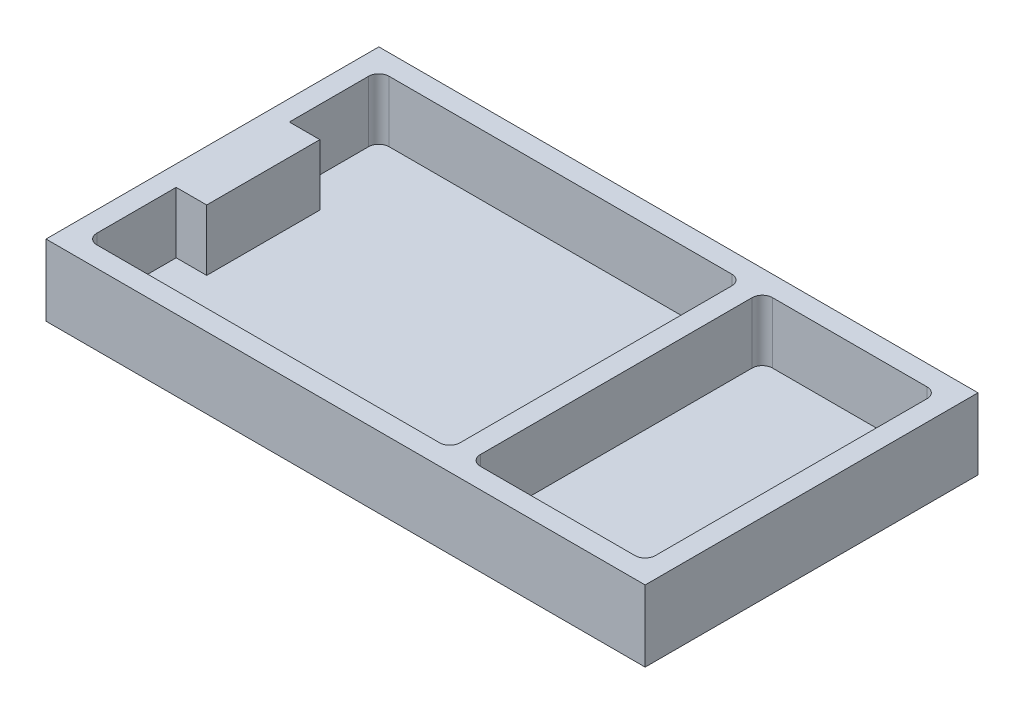
ISO-10303-21;
HEADER;
FILE_DESCRIPTION(('STEP AP214'),'2;1');
FILE_NAME('part.step','',(''),(''),'','','');
FILE_SCHEMA(('AUTOMOTIVE_DESIGN { 1 0 10303 214 1 1 1 1 }'));
ENDSEC;
DATA;
#1=APPLICATION_CONTEXT('core data for automotive mechanical design processes');
#2=APPLICATION_PROTOCOL_DEFINITION('international standard','automotive_design',2000,#1);
#3=PRODUCT_CONTEXT('',#1,'mechanical');
#4=PRODUCT('Part','Part','',(#3));
#5=PRODUCT_RELATED_PRODUCT_CATEGORY('part','',(#4));
#6=PRODUCT_DEFINITION_FORMATION('','',#4);
#7=PRODUCT_DEFINITION_CONTEXT('part definition',#1,'design');
#8=PRODUCT_DEFINITION('design','',#6,#7);
#9=PRODUCT_DEFINITION_SHAPE('','',#8);
#10=(LENGTH_UNIT() NAMED_UNIT(*) SI_UNIT(.MILLI.,.METRE.));
#11=(NAMED_UNIT(*) PLANE_ANGLE_UNIT() SI_UNIT($,.RADIAN.));
#12=(NAMED_UNIT(*) SI_UNIT($,.STERADIAN.) SOLID_ANGLE_UNIT());
#13=UNCERTAINTY_MEASURE_WITH_UNIT(LENGTH_MEASURE(1.E-05),#10,'distance_accuracy_value','');
#14=(GEOMETRIC_REPRESENTATION_CONTEXT(3) GLOBAL_UNCERTAINTY_ASSIGNED_CONTEXT((#13)) GLOBAL_UNIT_ASSIGNED_CONTEXT((#10,
#11,#12)) REPRESENTATION_CONTEXT('',''));
#15=CARTESIAN_POINT('',(0.,0.,0.));
#16=DIRECTION('',(0.,0.,1.));
#17=DIRECTION('',(1.,0.,0.));
#18=AXIS2_PLACEMENT_3D('',#15,#16,#17);
#19=CARTESIAN_POINT('',(6.35,19.05,-9.52500000000002));
#20=DIRECTION('',(1.,0.,0.));
#21=DIRECTION('',(0.,0.,-1.));
#22=AXIS2_PLACEMENT_3D('',#19,#20,#21);
#23=PLANE('',#22);
#24=DIRECTION('',(0.,0.,1.));
#25=VECTOR('',#24,1.);
#26=CARTESIAN_POINT('',(6.35,19.05,-9.52500000000002));
#27=LINE('',#26,#25);
#28=CARTESIAN_POINT('',(6.35,19.05,-94.3855006495616));
#29=VERTEX_POINT('',#28);
#30=CARTESIAN_POINT('',(6.35,19.05,-69.6198810273847));
#31=VERTEX_POINT('',#30);
#32=EDGE_CURVE('E54',#29,#31,#27,.T.);
#33=ORIENTED_EDGE('',*,*,#32,.T.);
#34=DIRECTION('',(0.,1.,0.));
#35=VECTOR('',#34,1.);
#36=CARTESIAN_POINT('',(6.35,19.05,-69.6198810273847));
#37=LINE('',#36,#35);
#38=CARTESIAN_POINT('',(6.35,0.,-69.6198810273847));
#39=VERTEX_POINT('',#38);
#40=EDGE_CURVE('E216',#39,#31,#37,.T.);
#41=ORIENTED_EDGE('',*,*,#40,.F.);
#42=DIRECTION('',(0.,0.,1.));
#43=VECTOR('',#42,1.);
#44=CARTESIAN_POINT('',(6.35,0.,-9.52500000000002));
#45=LINE('',#44,#43);
#46=CARTESIAN_POINT('',(6.35,0.,-94.3855006495616));
#47=VERTEX_POINT('',#46);
#48=EDGE_CURVE('E321',#47,#39,#45,.T.);
#49=ORIENTED_EDGE('',*,*,#48,.F.);
#50=DIRECTION('',(0.,-1.,0.));
#51=VECTOR('',#50,1.);
#52=CARTESIAN_POINT('',(6.35,19.05,-94.3855006495616));
#53=LINE('',#52,#51);
#54=EDGE_CURVE('E345',#29,#47,#53,.T.);
#55=ORIENTED_EDGE('',*,*,#54,.F.);
#56=EDGE_LOOP('',(#33,#41,#49,#55));
#57=FACE_BOUND('',#56,.T.);
#58=ADVANCED_FACE('F31',(#57),#23,.T.);
#59=CARTESIAN_POINT('',(6.35,0.,-34.2906196221769));
#60=VERTEX_POINT('',#59);
#61=CARTESIAN_POINT('',(6.35,0.,-9.52500000000002));
#62=VERTEX_POINT('',#61);
#63=EDGE_CURVE('E320',#60,#62,#45,.T.);
#64=ORIENTED_EDGE('',*,*,#63,.F.);
#65=DIRECTION('',(0.,-1.,0.));
#66=VECTOR('',#65,1.);
#67=CARTESIAN_POINT('',(6.35,19.05,-34.2906196221769));
#68=LINE('',#67,#66);
#69=CARTESIAN_POINT('',(6.35,19.05,-34.2906196221769));
#70=VERTEX_POINT('',#69);
#71=EDGE_CURVE('E46',#70,#60,#68,.T.);
#72=ORIENTED_EDGE('',*,*,#71,.F.);
#73=CARTESIAN_POINT('',(6.35,19.05,-9.52500000000002));
#74=VERTEX_POINT('',#73);
#75=EDGE_CURVE('E300',#70,#74,#27,.T.);
#76=ORIENTED_EDGE('',*,*,#75,.T.);
#77=DIRECTION('',(0.,-1.,0.));
#78=VECTOR('',#77,1.);
#79=CARTESIAN_POINT('',(6.35,19.05,-9.52500000000002));
#80=LINE('',#79,#78);
#81=EDGE_CURVE('E342',#74,#62,#80,.T.);
#82=ORIENTED_EDGE('',*,*,#81,.T.);
#83=EDGE_LOOP('',(#64,#72,#76,#82));
#84=FACE_BOUND('',#83,.T.);
#85=ADVANCED_FACE('F437',(#84),#23,.T.);
#86=CARTESIAN_POINT('',(0.,0.,0.));
#87=DIRECTION('',(0.,1.,0.));
#88=DIRECTION('',(0.,0.,1.));
#89=AXIS2_PLACEMENT_3D('',#86,#87,#88);
#90=PLANE('',#89);
#91=ORIENTED_EDGE('',*,*,#48,.T.);
#92=DIRECTION('',(-1.,0.,0.));
#93=VECTOR('',#92,1.);
#94=CARTESIAN_POINT('',(15.875,0.,-69.6198810273847));
#95=LINE('',#94,#93);
#96=CARTESIAN_POINT('',(15.875,0.,-69.6198810273847));
#97=VERTEX_POINT('',#96);
#98=EDGE_CURVE('E678',#97,#39,#95,.T.);
#99=ORIENTED_EDGE('',*,*,#98,.F.);
#100=DIRECTION('',(0.,0.,-1.));
#101=VECTOR('',#100,1.);
#102=CARTESIAN_POINT('',(15.875,0.,-34.2906196221769));
#103=LINE('',#102,#101);
#104=CARTESIAN_POINT('',(15.875,0.,-34.2906196221769));
#105=VERTEX_POINT('',#104);
#106=EDGE_CURVE('E211',#105,#97,#103,.T.);
#107=ORIENTED_EDGE('',*,*,#106,.F.);
#108=DIRECTION('',(-1.,0.,0.));
#109=VECTOR('',#108,1.);
#110=CARTESIAN_POINT('',(15.875,0.,-34.2906196221769));
#111=LINE('',#110,#109);
#112=EDGE_CURVE('E222',#105,#60,#111,.T.);
#113=ORIENTED_EDGE('',*,*,#112,.T.);
#114=ORIENTED_EDGE('',*,*,#63,.T.);
#115=CARTESIAN_POINT('',(9.525,0.,-9.525));
#116=DIRECTION('',(0.,1.,0.));
#117=DIRECTION('',(0.,0.,-1.));
#118=AXIS2_PLACEMENT_3D('',#115,#116,#117);
#119=CIRCLE('',#118,3.175);
#120=CARTESIAN_POINT('',(9.52500000000002,0.,-6.35));
#121=VERTEX_POINT('',#120);
#122=EDGE_CURVE('E324',#62,#121,#119,.T.);
#123=ORIENTED_EDGE('',*,*,#122,.T.);
#124=DIRECTION('',(1.,0.,0.));
#125=VECTOR('',#124,1.);
#126=CARTESIAN_POINT('',(9.52500000000002,0.,-6.35));
#127=LINE('',#126,#125);
#128=CARTESIAN_POINT('',(116.541319733707,0.,-6.35));
#129=VERTEX_POINT('',#128);
#130=EDGE_CURVE('E327',#121,#129,#127,.T.);
#131=ORIENTED_EDGE('',*,*,#130,.T.);
#132=CARTESIAN_POINT('',(116.541319733707,0.,-9.525));
#133=DIRECTION('',(0.,1.,0.));
#134=DIRECTION('',(0.,0.,-1.));
#135=AXIS2_PLACEMENT_3D('',#132,#133,#134);
#136=CIRCLE('',#135,3.175);
#137=CARTESIAN_POINT('',(119.716319733707,0.,-9.52500000000002));
#138=VERTEX_POINT('',#137);
#139=EDGE_CURVE('E330',#129,#138,#136,.T.);
#140=ORIENTED_EDGE('',*,*,#139,.T.);
#141=DIRECTION('',(0.,0.,-1.));
#142=VECTOR('',#141,1.);
#143=CARTESIAN_POINT('',(119.716319733707,0.,-94.3855006495616));
#144=LINE('',#143,#142);
#145=CARTESIAN_POINT('',(119.716319733707,0.,-94.3855006495616));
#146=VERTEX_POINT('',#145);
#147=EDGE_CURVE('E296',#138,#146,#144,.T.);
#148=ORIENTED_EDGE('',*,*,#147,.T.);
#149=CARTESIAN_POINT('',(116.541319733707,0.,-94.3855006495616));
#150=DIRECTION('',(0.,1.,0.));
#151=DIRECTION('',(0.,0.,1.));
#152=AXIS2_PLACEMENT_3D('',#149,#150,#151);
#153=CIRCLE('',#152,3.175);
#154=CARTESIAN_POINT('',(116.541319733707,0.,-97.5605006495616));
#155=VERTEX_POINT('',#154);
#156=EDGE_CURVE('E292',#146,#155,#153,.T.);
#157=ORIENTED_EDGE('',*,*,#156,.T.);
#158=DIRECTION('',(-1.,0.,0.));
#159=VECTOR('',#158,1.);
#160=CARTESIAN_POINT('',(9.52500000000002,0.,-97.5605006495616));
#161=LINE('',#160,#159);
#162=CARTESIAN_POINT('',(9.52500000000003,0.,-97.5605006495616));
#163=VERTEX_POINT('',#162);
#164=EDGE_CURVE('E314',#155,#163,#161,.T.);
#165=ORIENTED_EDGE('',*,*,#164,.T.);
#166=CARTESIAN_POINT('',(9.525,0.,-94.3855006495616));
#167=DIRECTION('',(0.,1.,0.));
#168=DIRECTION('',(0.,0.,-1.));
#169=AXIS2_PLACEMENT_3D('',#166,#167,#168);
#170=CIRCLE('',#169,3.175);
#171=EDGE_CURVE('E317',#163,#47,#170,.T.);
#172=ORIENTED_EDGE('',*,*,#171,.T.);
#173=EDGE_LOOP('',(#91,#99,#107,#113,#114,#123,#131,#140,#148,#157,#165,#172));
#174=FACE_BOUND('',#173,.T.);
#175=ADVANCED_FACE('F386',(#174),#90,.T.);
#176=CARTESIAN_POINT('',(0.,19.05,-103.910500649562));
#177=DIRECTION('',(0.,-1.,0.));
#178=DIRECTION('',(0.,0.,-1.));
#179=AXIS2_PLACEMENT_3D('',#176,#177,#178);
#180=PLANE('',#179);
#181=CARTESIAN_POINT('',(116.541319733707,19.05,-94.3855006495616));
#182=DIRECTION('',(0.,1.,0.));
#183=DIRECTION('',(0.,0.,1.));
#184=AXIS2_PLACEMENT_3D('',#181,#182,#183);
#185=CIRCLE('',#184,3.175);
#186=CARTESIAN_POINT('',(119.716319733707,19.05,-94.3855006495616));
#187=VERTEX_POINT('',#186);
#188=CARTESIAN_POINT('',(116.541319733707,19.05,-97.5605006495616));
#189=VERTEX_POINT('',#188);
#190=EDGE_CURVE('E293',#187,#189,#185,.T.);
#191=ORIENTED_EDGE('',*,*,#190,.F.);
#192=DIRECTION('',(0.,0.,-1.));
#193=VECTOR('',#192,1.);
#194=CARTESIAN_POINT('',(119.716319733707,19.05,-94.3855006495616));
#195=LINE('',#194,#193);
#196=CARTESIAN_POINT('',(119.716319733707,19.05,-9.52500000000002));
#197=VERTEX_POINT('',#196);
#198=EDGE_CURVE('E309',#197,#187,#195,.T.);
#199=ORIENTED_EDGE('',*,*,#198,.F.);
#200=CARTESIAN_POINT('',(116.541319733707,19.05,-9.525));
#201=DIRECTION('',(0.,1.,0.));
#202=DIRECTION('',(0.,0.,-1.));
#203=AXIS2_PLACEMENT_3D('',#200,#201,#202);
#204=CIRCLE('',#203,3.175);
#205=CARTESIAN_POINT('',(116.541319733707,19.05,-6.35));
#206=VERTEX_POINT('',#205);
#207=EDGE_CURVE('E306',#206,#197,#204,.T.);
#208=ORIENTED_EDGE('',*,*,#207,.F.);
#209=DIRECTION('',(1.,0.,0.));
#210=VECTOR('',#209,1.);
#211=CARTESIAN_POINT('',(9.52500000000002,19.05,-6.35));
#212=LINE('',#211,#210);
#213=CARTESIAN_POINT('',(9.52500000000002,19.05,-6.35));
#214=VERTEX_POINT('',#213);
#215=EDGE_CURVE('E304',#214,#206,#212,.T.);
#216=ORIENTED_EDGE('',*,*,#215,.F.);
#217=CARTESIAN_POINT('',(9.525,19.05,-9.525));
#218=DIRECTION('',(0.,1.,0.));
#219=DIRECTION('',(0.,0.,-1.));
#220=AXIS2_PLACEMENT_3D('',#217,#218,#219);
#221=CIRCLE('',#220,3.175);
#222=EDGE_CURVE('E302',#74,#214,#221,.T.);
#223=ORIENTED_EDGE('',*,*,#222,.F.);
#224=ORIENTED_EDGE('',*,*,#75,.F.);
#225=DIRECTION('',(-1.,0.,0.));
#226=VECTOR('',#225,1.);
#227=CARTESIAN_POINT('',(15.875,19.05,-34.2906196221769));
#228=LINE('',#227,#226);
#229=CARTESIAN_POINT('',(15.875,19.05,-34.2906196221769));
#230=VERTEX_POINT('',#229);
#231=EDGE_CURVE('E201',#230,#70,#228,.T.);
#232=ORIENTED_EDGE('',*,*,#231,.F.);
#233=DIRECTION('',(0.,0.,1.));
#234=VECTOR('',#233,1.);
#235=CARTESIAN_POINT('',(15.875,19.05,-34.2906196221769));
#236=LINE('',#235,#234);
#237=CARTESIAN_POINT('',(15.875,19.05,-69.6198810273847));
#238=VERTEX_POINT('',#237);
#239=EDGE_CURVE('E192',#238,#230,#236,.T.);
#240=ORIENTED_EDGE('',*,*,#239,.F.);
#241=DIRECTION('',(-1.,0.,0.));
#242=VECTOR('',#241,1.);
#243=CARTESIAN_POINT('',(15.875,19.05,-69.6198810273847));
#244=LINE('',#243,#242);
#245=EDGE_CURVE('E198',#238,#31,#244,.T.);
#246=ORIENTED_EDGE('',*,*,#245,.T.);
#247=ORIENTED_EDGE('',*,*,#32,.F.);
#248=CARTESIAN_POINT('',(9.525,19.05,-94.3855006495616));
#249=DIRECTION('',(0.,1.,0.));
#250=DIRECTION('',(0.,0.,-1.));
#251=AXIS2_PLACEMENT_3D('',#248,#249,#250);
#252=CIRCLE('',#251,3.175);
#253=CARTESIAN_POINT('',(9.52500000000003,19.05,-97.5605006495616));
#254=VERTEX_POINT('',#253);
#255=EDGE_CURVE('E298',#254,#29,#252,.T.);
#256=ORIENTED_EDGE('',*,*,#255,.F.);
#257=DIRECTION('',(-1.,0.,0.));
#258=VECTOR('',#257,1.);
#259=CARTESIAN_POINT('',(9.52500000000002,19.05,-97.5605006495616));
#260=LINE('',#259,#258);
#261=EDGE_CURVE('E295',#189,#254,#260,.T.);
#262=ORIENTED_EDGE('',*,*,#261,.F.);
#263=EDGE_LOOP('',(#191,#199,#208,#216,#223,#224,#232,#240,#246,#247,#256,#262));
#264=FACE_BOUND('',#263,.T.);
#265=DIRECTION('',(0.,0.,1.));
#266=VECTOR('',#265,1.);
#267=CARTESIAN_POINT('',(0.,19.05,0.));
#268=LINE('',#267,#266);
#269=CARTESIAN_POINT('',(0.,19.05,-103.910500649562));
#270=VERTEX_POINT('',#269);
#271=CARTESIAN_POINT('',(0.,19.05,0.));
#272=VERTEX_POINT('',#271);
#273=EDGE_CURVE('E352',#270,#272,#268,.T.);
#274=ORIENTED_EDGE('',*,*,#273,.T.);
#275=DIRECTION('',(1.,0.,0.));
#276=VECTOR('',#275,1.);
#277=CARTESIAN_POINT('',(0.,19.05,0.));
#278=LINE('',#277,#276);
#279=CARTESIAN_POINT('',(187.051787580175,19.05,0.));
#280=VERTEX_POINT('',#279);
#281=EDGE_CURVE('E355',#272,#280,#278,.T.);
#282=ORIENTED_EDGE('',*,*,#281,.T.);
#283=DIRECTION('',(0.,0.,-1.));
#284=VECTOR('',#283,1.);
#285=CARTESIAN_POINT('',(187.051787580175,19.05,0.));
#286=LINE('',#285,#284);
#287=CARTESIAN_POINT('',(187.051787580175,19.05,-103.910500649562));
#288=VERTEX_POINT('',#287);
#289=EDGE_CURVE('E357',#280,#288,#286,.T.);
#290=ORIENTED_EDGE('',*,*,#289,.T.);
#291=DIRECTION('',(-1.,0.,0.));
#292=VECTOR('',#291,1.);
#293=CARTESIAN_POINT('',(0.,19.05,-103.910500649562));
#294=LINE('',#293,#292);
#295=EDGE_CURVE('E359',#288,#270,#294,.T.);
#296=ORIENTED_EDGE('',*,*,#295,.T.);
#297=EDGE_LOOP('',(#274,#282,#290,#296));
#298=FACE_BOUND('',#297,.T.);
#299=CARTESIAN_POINT('',(129.241319733707,19.05,-94.3855006495616));
#300=DIRECTION('',(0.,1.,0.));
#301=DIRECTION('',(0.,0.,1.));
#302=AXIS2_PLACEMENT_3D('',#299,#300,#301);
#303=CIRCLE('',#302,3.175);
#304=CARTESIAN_POINT('',(129.241319733707,19.05,-97.5605006495616));
#305=VERTEX_POINT('',#304);
#306=CARTESIAN_POINT('',(126.066319733707,19.05,-94.3855006495616));
#307=VERTEX_POINT('',#306);
#308=EDGE_CURVE('E235',#305,#307,#303,.T.);
#309=ORIENTED_EDGE('',*,*,#308,.F.);
#310=DIRECTION('',(-1.,0.,0.));
#311=VECTOR('',#310,1.);
#312=CARTESIAN_POINT('',(129.241319733707,19.05,-97.5605006495616));
#313=LINE('',#312,#311);
#314=CARTESIAN_POINT('',(177.526787580175,19.05,-97.5605006495616));
#315=VERTEX_POINT('',#314);
#316=EDGE_CURVE('E251',#315,#305,#313,.T.);
#317=ORIENTED_EDGE('',*,*,#316,.F.);
#318=CARTESIAN_POINT('',(177.526787580175,19.05,-94.3855006495616));
#319=DIRECTION('',(0.,1.,0.));
#320=DIRECTION('',(0.,0.,1.));
#321=AXIS2_PLACEMENT_3D('',#318,#319,#320);
#322=CIRCLE('',#321,3.175);
#323=CARTESIAN_POINT('',(180.701787580175,19.05,-94.3855006495616));
#324=VERTEX_POINT('',#323);
#325=EDGE_CURVE('E248',#324,#315,#322,.T.);
#326=ORIENTED_EDGE('',*,*,#325,.F.);
#327=DIRECTION('',(0.,0.,-1.));
#328=VECTOR('',#327,1.);
#329=CARTESIAN_POINT('',(180.701787580175,19.05,-9.52500000000002));
#330=LINE('',#329,#328);
#331=CARTESIAN_POINT('',(180.701787580175,19.05,-9.52500000000002));
#332=VERTEX_POINT('',#331);
#333=EDGE_CURVE('E246',#332,#324,#330,.T.);
#334=ORIENTED_EDGE('',*,*,#333,.F.);
#335=CARTESIAN_POINT('',(177.526787580175,19.05,-9.525));
#336=DIRECTION('',(0.,1.,0.));
#337=DIRECTION('',(0.,0.,-1.));
#338=AXIS2_PLACEMENT_3D('',#335,#336,#337);
#339=CIRCLE('',#338,3.17500000000001);
#340=CARTESIAN_POINT('',(177.526787580175,19.05,-6.34999999999999));
#341=VERTEX_POINT('',#340);
#342=EDGE_CURVE('E244',#341,#332,#339,.T.);
#343=ORIENTED_EDGE('',*,*,#342,.F.);
#344=DIRECTION('',(1.,0.,0.));
#345=VECTOR('',#344,1.);
#346=CARTESIAN_POINT('',(129.241319733707,19.05,-6.34999999999999));
#347=LINE('',#346,#345);
#348=CARTESIAN_POINT('',(129.241319733707,19.05,-6.34999999999999));
#349=VERTEX_POINT('',#348);
#350=EDGE_CURVE('E242',#349,#341,#347,.T.);
#351=ORIENTED_EDGE('',*,*,#350,.F.);
#352=CARTESIAN_POINT('',(129.241319733707,19.05,-9.525));
#353=DIRECTION('',(0.,1.,0.));
#354=DIRECTION('',(0.,0.,1.));
#355=AXIS2_PLACEMENT_3D('',#352,#353,#354);
#356=CIRCLE('',#355,3.17500000000001);
#357=CARTESIAN_POINT('',(126.066319733707,19.05,-9.52500000000002));
#358=VERTEX_POINT('',#357);
#359=EDGE_CURVE('E240',#358,#349,#356,.T.);
#360=ORIENTED_EDGE('',*,*,#359,.F.);
#361=DIRECTION('',(0.,0.,1.));
#362=VECTOR('',#361,1.);
#363=CARTESIAN_POINT('',(126.066319733707,19.05,-94.3855006495616));
#364=LINE('',#363,#362);
#365=EDGE_CURVE('E237',#307,#358,#364,.T.);
#366=ORIENTED_EDGE('',*,*,#365,.F.);
#367=EDGE_LOOP('',(#309,#317,#326,#334,#343,#351,#360,#366));
#368=FACE_BOUND('',#367,.T.);
#369=ADVANCED_FACE('F195',(#264,#298,#368),#180,.F.);
#370=CARTESIAN_POINT('',(0.,19.05,0.));
#371=DIRECTION('',(1.,0.,0.));
#372=DIRECTION('',(0.,0.,-1.));
#373=AXIS2_PLACEMENT_3D('',#370,#371,#372);
#374=PLANE('',#373);
#375=DIRECTION('',(0.,-1.,0.));
#376=VECTOR('',#375,1.);
#377=CARTESIAN_POINT('',(0.,19.05,-103.910500649562));
#378=LINE('',#377,#376);
#379=CARTESIAN_POINT('',(0.,-3.175,-103.910500649562));
#380=VERTEX_POINT('',#379);
#381=EDGE_CURVE('E361',#270,#380,#378,.T.);
#382=ORIENTED_EDGE('',*,*,#381,.T.);
#383=DIRECTION('',(0.,0.,1.));
#384=VECTOR('',#383,1.);
#385=CARTESIAN_POINT('',(0.,-3.175,-103.910500649562));
#386=LINE('',#385,#384);
#387=CARTESIAN_POINT('',(0.,-3.175,0.));
#388=VERTEX_POINT('',#387);
#389=EDGE_CURVE('E217',#380,#388,#386,.T.);
#390=ORIENTED_EDGE('',*,*,#389,.T.);
#391=DIRECTION('',(0.,-1.,0.));
#392=VECTOR('',#391,1.);
#393=CARTESIAN_POINT('',(0.,19.05,0.));
#394=LINE('',#393,#392);
#395=EDGE_CURVE('E11',#272,#388,#394,.T.);
#396=ORIENTED_EDGE('',*,*,#395,.F.);
#397=ORIENTED_EDGE('',*,*,#273,.F.);
#398=EDGE_LOOP('',(#382,#390,#396,#397));
#399=FACE_BOUND('',#398,.T.);
#400=ADVANCED_FACE('F33',(#399),#374,.F.);
#401=CARTESIAN_POINT('',(0.,19.05,0.));
#402=DIRECTION('',(0.,0.,-1.));
#403=DIRECTION('',(-1.,0.,0.));
#404=AXIS2_PLACEMENT_3D('',#401,#402,#403);
#405=PLANE('',#404);
#406=ORIENTED_EDGE('',*,*,#395,.T.);
#407=DIRECTION('',(1.,0.,0.));
#408=VECTOR('',#407,1.);
#409=CARTESIAN_POINT('',(0.,-3.175,0.));
#410=LINE('',#409,#408);
#411=CARTESIAN_POINT('',(187.051787580175,-3.175,0.));
#412=VERTEX_POINT('',#411);
#413=EDGE_CURVE('E220',#388,#412,#410,.T.);
#414=ORIENTED_EDGE('',*,*,#413,.T.);
#415=DIRECTION('',(0.,-1.,0.));
#416=VECTOR('',#415,1.);
#417=CARTESIAN_POINT('',(187.051787580175,19.05,0.));
#418=LINE('',#417,#416);
#419=EDGE_CURVE('E39',#280,#412,#418,.T.);
#420=ORIENTED_EDGE('',*,*,#419,.F.);
#421=ORIENTED_EDGE('',*,*,#281,.F.);
#422=EDGE_LOOP('',(#406,#414,#420,#421));
#423=FACE_BOUND('',#422,.T.);
#424=ADVANCED_FACE('F376',(#423),#405,.F.);
#425=CARTESIAN_POINT('',(187.051787580175,19.05,0.));
#426=DIRECTION('',(-1.,0.,0.));
#427=DIRECTION('',(0.,0.,1.));
#428=AXIS2_PLACEMENT_3D('',#425,#426,#427);
#429=PLANE('',#428);
#430=ORIENTED_EDGE('',*,*,#419,.T.);
#431=DIRECTION('',(0.,0.,-1.));
#432=VECTOR('',#431,1.);
#433=CARTESIAN_POINT('',(187.051787580175,-3.175,-103.910500649562));
#434=LINE('',#433,#432);
#435=CARTESIAN_POINT('',(187.051787580175,-3.175,-103.910500649562));
#436=VERTEX_POINT('',#435);
#437=EDGE_CURVE('E228',#412,#436,#434,.T.);
#438=ORIENTED_EDGE('',*,*,#437,.T.);
#439=DIRECTION('',(0.,-1.,0.));
#440=VECTOR('',#439,1.);
#441=CARTESIAN_POINT('',(187.051787580175,19.05,-103.910500649562));
#442=LINE('',#441,#440);
#443=EDGE_CURVE('E363',#288,#436,#442,.T.);
#444=ORIENTED_EDGE('',*,*,#443,.F.);
#445=ORIENTED_EDGE('',*,*,#289,.F.);
#446=EDGE_LOOP('',(#430,#438,#444,#445));
#447=FACE_BOUND('',#446,.T.);
#448=ADVANCED_FACE('F368',(#447),#429,.F.);
#449=CARTESIAN_POINT('',(0.,19.05,-103.910500649562));
#450=DIRECTION('',(0.,0.,1.));
#451=DIRECTION('',(1.,0.,0.));
#452=AXIS2_PLACEMENT_3D('',#449,#450,#451);
#453=PLANE('',#452);
#454=ORIENTED_EDGE('',*,*,#443,.T.);
#455=DIRECTION('',(-1.,0.,0.));
#456=VECTOR('',#455,1.);
#457=CARTESIAN_POINT('',(0.,-3.175,-103.910500649562));
#458=LINE('',#457,#456);
#459=EDGE_CURVE('E231',#436,#380,#458,.T.);
#460=ORIENTED_EDGE('',*,*,#459,.T.);
#461=ORIENTED_EDGE('',*,*,#381,.F.);
#462=ORIENTED_EDGE('',*,*,#295,.F.);
#463=EDGE_LOOP('',(#454,#460,#461,#462));
#464=FACE_BOUND('',#463,.T.);
#465=ADVANCED_FACE('F382',(#464),#453,.F.);
#466=CARTESIAN_POINT('',(116.541319733707,19.05,-94.3855006495616));
#467=DIRECTION('',(0.,-1.,0.));
#468=DIRECTION('',(0.,0.,-1.));
#469=AXIS2_PLACEMENT_3D('',#466,#467,#468);
#470=CYLINDRICAL_SURFACE('',#469,3.175);
#471=ORIENTED_EDGE('',*,*,#156,.F.);
#472=DIRECTION('',(0.,-1.,0.));
#473=VECTOR('',#472,1.);
#474=CARTESIAN_POINT('',(119.716319733707,19.05,-94.3855006495616));
#475=LINE('',#474,#473);
#476=EDGE_CURVE('E311',#187,#146,#475,.T.);
#477=ORIENTED_EDGE('',*,*,#476,.F.);
#478=ORIENTED_EDGE('',*,*,#190,.T.);
#479=DIRECTION('',(0.,-1.,0.));
#480=VECTOR('',#479,1.);
#481=CARTESIAN_POINT('',(116.541319733707,19.05,-97.5605006495616));
#482=LINE('',#481,#480);
#483=EDGE_CURVE('E349',#189,#155,#482,.T.);
#484=ORIENTED_EDGE('',*,*,#483,.T.);
#485=EDGE_LOOP('',(#471,#477,#478,#484));
#486=FACE_BOUND('',#485,.T.);
#487=ADVANCED_FACE('F453',(#486),#470,.F.);
#488=CARTESIAN_POINT('',(9.52500000000002,19.05,-97.5605006495616));
#489=DIRECTION('',(0.,0.,1.));
#490=DIRECTION('',(1.,0.,0.));
#491=AXIS2_PLACEMENT_3D('',#488,#489,#490);
#492=PLANE('',#491);
#493=ORIENTED_EDGE('',*,*,#164,.F.);
#494=ORIENTED_EDGE('',*,*,#483,.F.);
#495=ORIENTED_EDGE('',*,*,#261,.T.);
#496=DIRECTION('',(0.,-1.,0.));
#497=VECTOR('',#496,1.);
#498=CARTESIAN_POINT('',(9.52500000000003,19.05,-97.5605006495616));
#499=LINE('',#498,#497);
#500=EDGE_CURVE('E347',#254,#163,#499,.T.);
#501=ORIENTED_EDGE('',*,*,#500,.T.);
#502=EDGE_LOOP('',(#493,#494,#495,#501));
#503=FACE_BOUND('',#502,.T.);
#504=ADVANCED_FACE('F449',(#503),#492,.T.);
#505=CARTESIAN_POINT('',(9.525,19.05,-94.3855006495616));
#506=DIRECTION('',(0.,-1.,0.));
#507=DIRECTION('',(0.,0.,-1.));
#508=AXIS2_PLACEMENT_3D('',#505,#506,#507);
#509=CYLINDRICAL_SURFACE('',#508,3.175);
#510=ORIENTED_EDGE('',*,*,#171,.F.);
#511=ORIENTED_EDGE('',*,*,#500,.F.);
#512=ORIENTED_EDGE('',*,*,#255,.T.);
#513=ORIENTED_EDGE('',*,*,#54,.T.);
#514=EDGE_LOOP('',(#510,#511,#512,#513));
#515=FACE_BOUND('',#514,.T.);
#516=ADVANCED_FACE('F446',(#515),#509,.F.);
#517=CARTESIAN_POINT('',(9.525,19.05,-9.525));
#518=DIRECTION('',(0.,-1.,0.));
#519=DIRECTION('',(0.,0.,-1.));
#520=AXIS2_PLACEMENT_3D('',#517,#518,#519);
#521=CYLINDRICAL_SURFACE('',#520,3.175);
#522=ORIENTED_EDGE('',*,*,#122,.F.);
#523=ORIENTED_EDGE('',*,*,#81,.F.);
#524=ORIENTED_EDGE('',*,*,#222,.T.);
#525=DIRECTION('',(0.,-1.,0.));
#526=VECTOR('',#525,1.);
#527=CARTESIAN_POINT('',(9.52500000000002,19.05,-6.35));
#528=LINE('',#527,#526);
#529=EDGE_CURVE('E340',#214,#121,#528,.T.);
#530=ORIENTED_EDGE('',*,*,#529,.T.);
#531=EDGE_LOOP('',(#522,#523,#524,#530));
#532=FACE_BOUND('',#531,.T.);
#533=ADVANCED_FACE('F444',(#532),#521,.F.);
#534=CARTESIAN_POINT('',(9.52500000000002,19.05,-6.35));
#535=DIRECTION('',(0.,0.,-1.));
#536=DIRECTION('',(-1.,0.,0.));
#537=AXIS2_PLACEMENT_3D('',#534,#535,#536);
#538=PLANE('',#537);
#539=ORIENTED_EDGE('',*,*,#130,.F.);
#540=ORIENTED_EDGE('',*,*,#529,.F.);
#541=ORIENTED_EDGE('',*,*,#215,.T.);
#542=DIRECTION('',(0.,-1.,0.));
#543=VECTOR('',#542,1.);
#544=CARTESIAN_POINT('',(116.541319733707,19.05,-6.35));
#545=LINE('',#544,#543);
#546=EDGE_CURVE('E338',#206,#129,#545,.T.);
#547=ORIENTED_EDGE('',*,*,#546,.T.);
#548=EDGE_LOOP('',(#539,#540,#541,#547));
#549=FACE_BOUND('',#548,.T.);
#550=ADVANCED_FACE('F580',(#549),#538,.T.);
#551=CARTESIAN_POINT('',(116.541319733707,19.05,-9.525));
#552=DIRECTION('',(0.,-1.,0.));
#553=DIRECTION('',(0.,0.,-1.));
#554=AXIS2_PLACEMENT_3D('',#551,#552,#553);
#555=CYLINDRICAL_SURFACE('',#554,3.175);
#556=ORIENTED_EDGE('',*,*,#139,.F.);
#557=ORIENTED_EDGE('',*,*,#546,.F.);
#558=ORIENTED_EDGE('',*,*,#207,.T.);
#559=DIRECTION('',(0.,-1.,0.));
#560=VECTOR('',#559,1.);
#561=CARTESIAN_POINT('',(119.716319733707,19.05,-9.52500000000002));
#562=LINE('',#561,#560);
#563=EDGE_CURVE('E336',#197,#138,#562,.T.);
#564=ORIENTED_EDGE('',*,*,#563,.T.);
#565=EDGE_LOOP('',(#556,#557,#558,#564));
#566=FACE_BOUND('',#565,.T.);
#567=ADVANCED_FACE('F570',(#566),#555,.F.);
#568=CARTESIAN_POINT('',(119.716319733707,19.05,-94.3855006495616));
#569=DIRECTION('',(-1.,0.,0.));
#570=DIRECTION('',(0.,0.,1.));
#571=AXIS2_PLACEMENT_3D('',#568,#569,#570);
#572=PLANE('',#571);
#573=ORIENTED_EDGE('',*,*,#147,.F.);
#574=ORIENTED_EDGE('',*,*,#563,.F.);
#575=ORIENTED_EDGE('',*,*,#198,.T.);
#576=ORIENTED_EDGE('',*,*,#476,.T.);
#577=EDGE_LOOP('',(#573,#574,#575,#576));
#578=FACE_BOUND('',#577,.T.);
#579=ADVANCED_FACE('F561',(#578),#572,.T.);
#580=CARTESIAN_POINT('',(129.241319733707,19.05,-94.3855006495616));
#581=DIRECTION('',(0.,-1.,0.));
#582=DIRECTION('',(0.,0.,-1.));
#583=AXIS2_PLACEMENT_3D('',#580,#581,#582);
#584=CYLINDRICAL_SURFACE('',#583,3.175);
#585=CARTESIAN_POINT('',(129.241319733707,0.,-94.3855006495616));
#586=DIRECTION('',(0.,1.,0.));
#587=DIRECTION('',(0.,0.,1.));
#588=AXIS2_PLACEMENT_3D('',#585,#586,#587);
#589=CIRCLE('',#588,3.175);
#590=CARTESIAN_POINT('',(129.241319733707,0.,-97.5605006495616));
#591=VERTEX_POINT('',#590);
#592=CARTESIAN_POINT('',(126.066319733707,0.,-94.3855006495616));
#593=VERTEX_POINT('',#592);
#594=EDGE_CURVE('E234',#591,#593,#589,.T.);
#595=ORIENTED_EDGE('',*,*,#594,.F.);
#596=DIRECTION('',(0.,-1.,0.));
#597=VECTOR('',#596,1.);
#598=CARTESIAN_POINT('',(129.241319733707,19.05,-97.5605006495616));
#599=LINE('',#598,#597);
#600=EDGE_CURVE('E253',#305,#591,#599,.T.);
#601=ORIENTED_EDGE('',*,*,#600,.F.);
#602=ORIENTED_EDGE('',*,*,#308,.T.);
#603=DIRECTION('',(0.,-1.,0.));
#604=VECTOR('',#603,1.);
#605=CARTESIAN_POINT('',(126.066319733707,19.05,-94.3855006495616));
#606=LINE('',#605,#604);
#607=EDGE_CURVE('E289',#307,#593,#606,.T.);
#608=ORIENTED_EDGE('',*,*,#607,.T.);
#609=EDGE_LOOP('',(#595,#601,#602,#608));
#610=FACE_BOUND('',#609,.T.);
#611=ADVANCED_FACE('F397',(#610),#584,.F.);
#612=CARTESIAN_POINT('',(126.066319733707,19.05,-94.3855006495616));
#613=DIRECTION('',(1.,0.,0.));
#614=DIRECTION('',(0.,0.,-1.));
#615=AXIS2_PLACEMENT_3D('',#612,#613,#614);
#616=PLANE('',#615);
#617=DIRECTION('',(0.,0.,1.));
#618=VECTOR('',#617,1.);
#619=CARTESIAN_POINT('',(126.066319733707,0.,-94.3855006495616));
#620=LINE('',#619,#618);
#621=CARTESIAN_POINT('',(126.066319733707,0.,-9.52500000000002));
#622=VERTEX_POINT('',#621);
#623=EDGE_CURVE('E256',#593,#622,#620,.T.);
#624=ORIENTED_EDGE('',*,*,#623,.F.);
#625=ORIENTED_EDGE('',*,*,#607,.F.);
#626=ORIENTED_EDGE('',*,*,#365,.T.);
#627=DIRECTION('',(0.,-1.,0.));
#628=VECTOR('',#627,1.);
#629=CARTESIAN_POINT('',(126.066319733707,19.05,-9.52500000000002));
#630=LINE('',#629,#628);
#631=EDGE_CURVE('E287',#358,#622,#630,.T.);
#632=ORIENTED_EDGE('',*,*,#631,.T.);
#633=EDGE_LOOP('',(#624,#625,#626,#632));
#634=FACE_BOUND('',#633,.T.);
#635=ADVANCED_FACE('F399',(#634),#616,.T.);
#636=CARTESIAN_POINT('',(129.241319733707,19.05,-9.525));
#637=DIRECTION('',(0.,-1.,0.));
#638=DIRECTION('',(0.,0.,-1.));
#639=AXIS2_PLACEMENT_3D('',#636,#637,#638);
#640=CYLINDRICAL_SURFACE('',#639,3.17500000000001);
#641=CARTESIAN_POINT('',(129.241319733707,0.,-9.525));
#642=DIRECTION('',(0.,1.,0.));
#643=DIRECTION('',(0.,0.,1.));
#644=AXIS2_PLACEMENT_3D('',#641,#642,#643);
#645=CIRCLE('',#644,3.17500000000001);
#646=CARTESIAN_POINT('',(129.241319733707,0.,-6.34999999999999));
#647=VERTEX_POINT('',#646);
#648=EDGE_CURVE('E259',#622,#647,#645,.T.);
#649=ORIENTED_EDGE('',*,*,#648,.F.);
#650=ORIENTED_EDGE('',*,*,#631,.F.);
#651=ORIENTED_EDGE('',*,*,#359,.T.);
#652=DIRECTION('',(0.,-1.,0.));
#653=VECTOR('',#652,1.);
#654=CARTESIAN_POINT('',(129.241319733707,19.05,-6.34999999999999));
#655=LINE('',#654,#653);
#656=EDGE_CURVE('E285',#349,#647,#655,.T.);
#657=ORIENTED_EDGE('',*,*,#656,.T.);
#658=EDGE_LOOP('',(#649,#650,#651,#657));
#659=FACE_BOUND('',#658,.T.);
#660=ADVANCED_FACE('F427',(#659),#640,.F.);
#661=CARTESIAN_POINT('',(129.241319733707,19.05,-6.34999999999999));
#662=DIRECTION('',(0.,0.,-1.));
#663=DIRECTION('',(-1.,0.,0.));
#664=AXIS2_PLACEMENT_3D('',#661,#662,#663);
#665=PLANE('',#664);
#666=DIRECTION('',(1.,0.,0.));
#667=VECTOR('',#666,1.);
#668=CARTESIAN_POINT('',(129.241319733707,0.,-6.34999999999999));
#669=LINE('',#668,#667);
#670=CARTESIAN_POINT('',(177.526787580175,0.,-6.34999999999999));
#671=VERTEX_POINT('',#670);
#672=EDGE_CURVE('E262',#647,#671,#669,.T.);
#673=ORIENTED_EDGE('',*,*,#672,.F.);
#674=ORIENTED_EDGE('',*,*,#656,.F.);
#675=ORIENTED_EDGE('',*,*,#350,.T.);
#676=DIRECTION('',(0.,-1.,0.));
#677=VECTOR('',#676,1.);
#678=CARTESIAN_POINT('',(177.526787580175,19.05,-6.34999999999999));
#679=LINE('',#678,#677);
#680=EDGE_CURVE('E283',#341,#671,#679,.T.);
#681=ORIENTED_EDGE('',*,*,#680,.T.);
#682=EDGE_LOOP('',(#673,#674,#675,#681));
#683=FACE_BOUND('',#682,.T.);
#684=ADVANCED_FACE('F424',(#683),#665,.T.);
#685=CARTESIAN_POINT('',(177.526787580175,19.05,-9.525));
#686=DIRECTION('',(0.,-1.,0.));
#687=DIRECTION('',(0.,0.,-1.));
#688=AXIS2_PLACEMENT_3D('',#685,#686,#687);
#689=CYLINDRICAL_SURFACE('',#688,3.17500000000001);
#690=CARTESIAN_POINT('',(177.526787580175,0.,-9.525));
#691=DIRECTION('',(0.,1.,0.));
#692=DIRECTION('',(0.,0.,-1.));
#693=AXIS2_PLACEMENT_3D('',#690,#691,#692);
#694=CIRCLE('',#693,3.17500000000001);
#695=CARTESIAN_POINT('',(180.701787580175,0.,-9.52500000000002));
#696=VERTEX_POINT('',#695);
#697=EDGE_CURVE('E265',#671,#696,#694,.T.);
#698=ORIENTED_EDGE('',*,*,#697,.F.);
#699=ORIENTED_EDGE('',*,*,#680,.F.);
#700=ORIENTED_EDGE('',*,*,#342,.T.);
#701=DIRECTION('',(0.,-1.,0.));
#702=VECTOR('',#701,1.);
#703=CARTESIAN_POINT('',(180.701787580175,19.05,-9.52500000000002));
#704=LINE('',#703,#702);
#705=EDGE_CURVE('E281',#332,#696,#704,.T.);
#706=ORIENTED_EDGE('',*,*,#705,.T.);
#707=EDGE_LOOP('',(#698,#699,#700,#706));
#708=FACE_BOUND('',#707,.T.);
#709=ADVANCED_FACE('F420',(#708),#689,.F.);
#710=CARTESIAN_POINT('',(180.701787580175,19.05,-9.52500000000002));
#711=DIRECTION('',(-1.,0.,0.));
#712=DIRECTION('',(0.,0.,1.));
#713=AXIS2_PLACEMENT_3D('',#710,#711,#712);
#714=PLANE('',#713);
#715=DIRECTION('',(0.,0.,-1.));
#716=VECTOR('',#715,1.);
#717=CARTESIAN_POINT('',(180.701787580175,0.,-9.52500000000002));
#718=LINE('',#717,#716);
#719=CARTESIAN_POINT('',(180.701787580175,0.,-94.3855006495616));
#720=VERTEX_POINT('',#719);
#721=EDGE_CURVE('E268',#696,#720,#718,.T.);
#722=ORIENTED_EDGE('',*,*,#721,.F.);
#723=ORIENTED_EDGE('',*,*,#705,.F.);
#724=ORIENTED_EDGE('',*,*,#333,.T.);
#725=DIRECTION('',(0.,-1.,0.));
#726=VECTOR('',#725,1.);
#727=CARTESIAN_POINT('',(180.701787580175,19.05,-94.3855006495616));
#728=LINE('',#727,#726);
#729=EDGE_CURVE('E279',#324,#720,#728,.T.);
#730=ORIENTED_EDGE('',*,*,#729,.T.);
#731=EDGE_LOOP('',(#722,#723,#724,#730));
#732=FACE_BOUND('',#731,.T.);
#733=ADVANCED_FACE('F417',(#732),#714,.T.);
#734=CARTESIAN_POINT('',(177.526787580175,19.05,-94.3855006495616));
#735=DIRECTION('',(0.,-1.,0.));
#736=DIRECTION('',(0.,0.,-1.));
#737=AXIS2_PLACEMENT_3D('',#734,#735,#736);
#738=CYLINDRICAL_SURFACE('',#737,3.175);
#739=CARTESIAN_POINT('',(177.526787580175,0.,-94.3855006495616));
#740=DIRECTION('',(0.,1.,0.));
#741=DIRECTION('',(0.,0.,1.));
#742=AXIS2_PLACEMENT_3D('',#739,#740,#741);
#743=CIRCLE('',#742,3.175);
#744=CARTESIAN_POINT('',(177.526787580175,0.,-97.5605006495616));
#745=VERTEX_POINT('',#744);
#746=EDGE_CURVE('E271',#720,#745,#743,.T.);
#747=ORIENTED_EDGE('',*,*,#746,.F.);
#748=ORIENTED_EDGE('',*,*,#729,.F.);
#749=ORIENTED_EDGE('',*,*,#325,.T.);
#750=DIRECTION('',(0.,-1.,0.));
#751=VECTOR('',#750,1.);
#752=CARTESIAN_POINT('',(177.526787580175,19.05,-97.5605006495616));
#753=LINE('',#752,#751);
#754=EDGE_CURVE('E277',#315,#745,#753,.T.);
#755=ORIENTED_EDGE('',*,*,#754,.T.);
#756=EDGE_LOOP('',(#747,#748,#749,#755));
#757=FACE_BOUND('',#756,.T.);
#758=ADVANCED_FACE('F410',(#757),#738,.F.);
#759=CARTESIAN_POINT('',(129.241319733707,19.05,-97.5605006495616));
#760=DIRECTION('',(0.,0.,1.));
#761=DIRECTION('',(1.,0.,0.));
#762=AXIS2_PLACEMENT_3D('',#759,#760,#761);
#763=PLANE('',#762);
#764=DIRECTION('',(-1.,0.,0.));
#765=VECTOR('',#764,1.);
#766=CARTESIAN_POINT('',(129.241319733707,0.,-97.5605006495616));
#767=LINE('',#766,#765);
#768=EDGE_CURVE('E238',#745,#591,#767,.T.);
#769=ORIENTED_EDGE('',*,*,#768,.F.);
#770=ORIENTED_EDGE('',*,*,#754,.F.);
#771=ORIENTED_EDGE('',*,*,#316,.T.);
#772=ORIENTED_EDGE('',*,*,#600,.T.);
#773=EDGE_LOOP('',(#769,#770,#771,#772));
#774=FACE_BOUND('',#773,.T.);
#775=ADVANCED_FACE('F407',(#774),#763,.T.);
#776=ORIENTED_EDGE('',*,*,#768,.T.);
#777=ORIENTED_EDGE('',*,*,#594,.T.);
#778=ORIENTED_EDGE('',*,*,#623,.T.);
#779=ORIENTED_EDGE('',*,*,#648,.T.);
#780=ORIENTED_EDGE('',*,*,#672,.T.);
#781=ORIENTED_EDGE('',*,*,#697,.T.);
#782=ORIENTED_EDGE('',*,*,#721,.T.);
#783=ORIENTED_EDGE('',*,*,#746,.T.);
#784=EDGE_LOOP('',(#776,#777,#778,#779,#780,#781,#782,#783));
#785=FACE_BOUND('',#784,.T.);
#786=ADVANCED_FACE('F403',(#785),#90,.T.);
#787=CARTESIAN_POINT('',(0.,-3.175,0.));
#788=DIRECTION('',(0.,1.,0.));
#789=DIRECTION('',(0.,0.,1.));
#790=AXIS2_PLACEMENT_3D('',#787,#788,#789);
#791=PLANE('',#790);
#792=ORIENTED_EDGE('',*,*,#389,.F.);
#793=ORIENTED_EDGE('',*,*,#459,.F.);
#794=ORIENTED_EDGE('',*,*,#437,.F.);
#795=ORIENTED_EDGE('',*,*,#413,.F.);
#796=EDGE_LOOP('',(#792,#793,#794,#795));
#797=FACE_BOUND('',#796,.T.);
#798=ADVANCED_FACE('F375',(#797),#791,.F.);
#799=CARTESIAN_POINT('',(15.875,19.05,-69.6198810273847));
#800=DIRECTION('',(0.,0.,1.));
#801=DIRECTION('',(1.,0.,0.));
#802=AXIS2_PLACEMENT_3D('',#799,#800,#801);
#803=PLANE('',#802);
#804=ORIENTED_EDGE('',*,*,#40,.T.);
#805=ORIENTED_EDGE('',*,*,#245,.F.);
#806=DIRECTION('',(0.,1.,0.));
#807=VECTOR('',#806,1.);
#808=CARTESIAN_POINT('',(15.875,19.05,-69.6198810273847));
#809=LINE('',#808,#807);
#810=EDGE_CURVE('E206',#97,#238,#809,.T.);
#811=ORIENTED_EDGE('',*,*,#810,.F.);
#812=ORIENTED_EDGE('',*,*,#98,.T.);
#813=EDGE_LOOP('',(#804,#805,#811,#812));
#814=FACE_BOUND('',#813,.T.);
#815=ADVANCED_FACE('F215',(#814),#803,.F.);
#816=CARTESIAN_POINT('',(15.875,19.05,-34.2906196221769));
#817=DIRECTION('',(0.,0.,-1.));
#818=DIRECTION('',(-1.,0.,0.));
#819=AXIS2_PLACEMENT_3D('',#816,#817,#818);
#820=PLANE('',#819);
#821=ORIENTED_EDGE('',*,*,#71,.T.);
#822=ORIENTED_EDGE('',*,*,#112,.F.);
#823=DIRECTION('',(0.,-1.,0.));
#824=VECTOR('',#823,1.);
#825=CARTESIAN_POINT('',(15.875,19.05,-34.2906196221769));
#826=LINE('',#825,#824);
#827=EDGE_CURVE('E205',#230,#105,#826,.T.);
#828=ORIENTED_EDGE('',*,*,#827,.F.);
#829=ORIENTED_EDGE('',*,*,#231,.T.);
#830=EDGE_LOOP('',(#821,#822,#828,#829));
#831=FACE_BOUND('',#830,.T.);
#832=ADVANCED_FACE('F653',(#831),#820,.F.);
#833=CARTESIAN_POINT('',(15.875,0.,-69.6198810273847));
#834=DIRECTION('',(1.,0.,0.));
#835=DIRECTION('',(0.,0.,-1.));
#836=AXIS2_PLACEMENT_3D('',#833,#834,#835);
#837=PLANE('',#836);
#838=ORIENTED_EDGE('',*,*,#810,.T.);
#839=ORIENTED_EDGE('',*,*,#239,.T.);
#840=ORIENTED_EDGE('',*,*,#827,.T.);
#841=ORIENTED_EDGE('',*,*,#106,.T.);
#842=EDGE_LOOP('',(#838,#839,#840,#841));
#843=FACE_BOUND('',#842,.T.);
#844=ADVANCED_FACE('F210',(#843),#837,.T.);
#845=CLOSED_SHELL('',(#58,#85,#175,#369,#400,#424,#448,#465,#487,#504,#516,#533,#550,#567,#579,
#611,#635,#660,#684,#709,#733,#758,#775,#786,#798,#815,#832,#844));
#846=MANIFOLD_SOLID_BREP('B2',#845);
#847=ADVANCED_BREP_SHAPE_REPRESENTATION('',(#18,#846),#14);
#848=SHAPE_DEFINITION_REPRESENTATION(#9,#847);
ENDSEC;
END-ISO-10303-21;
